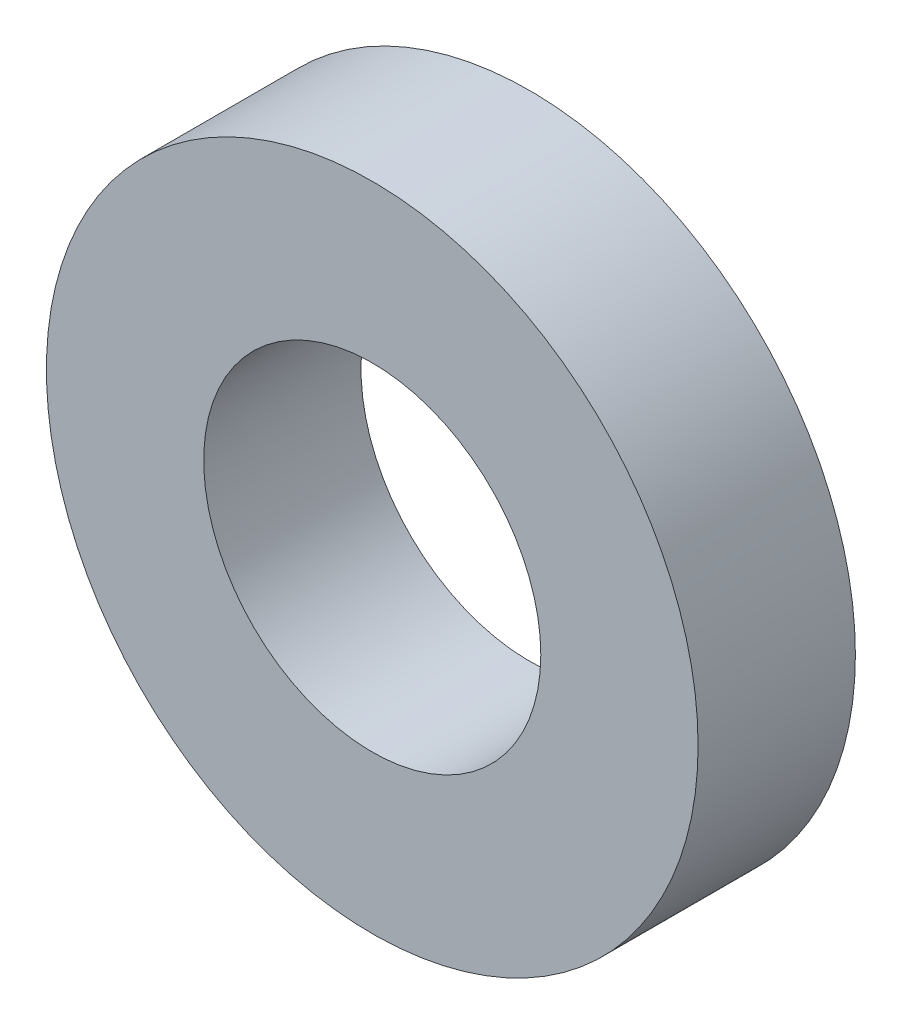
ISO-10303-21;
HEADER;
FILE_DESCRIPTION(('STEP AP214'),'2;1');
FILE_NAME('part.step','',(''),(''),'','','');
FILE_SCHEMA(('AUTOMOTIVE_DESIGN { 1 0 10303 214 1 1 1 1 }'));
ENDSEC;
DATA;
#1=APPLICATION_CONTEXT('core data for automotive mechanical design processes');
#2=APPLICATION_PROTOCOL_DEFINITION('international standard','automotive_design',2000,#1);
#3=PRODUCT_CONTEXT('',#1,'mechanical');
#4=PRODUCT('Part','Part','',(#3));
#5=PRODUCT_RELATED_PRODUCT_CATEGORY('part','',(#4));
#6=PRODUCT_DEFINITION_FORMATION('','',#4);
#7=PRODUCT_DEFINITION_CONTEXT('part definition',#1,'design');
#8=PRODUCT_DEFINITION('design','',#6,#7);
#9=PRODUCT_DEFINITION_SHAPE('','',#8);
#10=(LENGTH_UNIT() NAMED_UNIT(*) SI_UNIT(.MILLI.,.METRE.));
#11=(NAMED_UNIT(*) PLANE_ANGLE_UNIT() SI_UNIT($,.RADIAN.));
#12=(NAMED_UNIT(*) SI_UNIT($,.STERADIAN.) SOLID_ANGLE_UNIT());
#13=UNCERTAINTY_MEASURE_WITH_UNIT(LENGTH_MEASURE(1.E-05),#10,'distance_accuracy_value','');
#14=(GEOMETRIC_REPRESENTATION_CONTEXT(3) GLOBAL_UNCERTAINTY_ASSIGNED_CONTEXT((#13)) GLOBAL_UNIT_ASSIGNED_CONTEXT((#10,
#11,#12)) REPRESENTATION_CONTEXT('',''));
#15=CARTESIAN_POINT('',(0.,0.,0.));
#16=DIRECTION('',(0.,0.,1.));
#17=DIRECTION('',(1.,0.,0.));
#18=AXIS2_PLACEMENT_3D('',#15,#16,#17);
#19=CARTESIAN_POINT('',(0.,0.,1.4));
#20=DIRECTION('',(0.,0.,1.));
#21=DIRECTION('',(1.,0.,0.));
#22=AXIS2_PLACEMENT_3D('',#19,#20,#21);
#23=CYLINDRICAL_SURFACE('',#22,1.5);
#24=CARTESIAN_POINT('',(0.,0.,0.));
#25=DIRECTION('',(0.,0.,1.));
#26=DIRECTION('',(1.,0.,0.));
#27=AXIS2_PLACEMENT_3D('',#24,#25,#26);
#28=CIRCLE('',#27,1.5);
#29=CARTESIAN_POINT('',(1.5,0.,0.));
#30=VERTEX_POINT('',#29);
#31=EDGE_CURVE('E26',#30,#30,#28,.T.);
#32=ORIENTED_EDGE('',*,*,#31,.F.);
#33=EDGE_LOOP('',(#32));
#34=FACE_BOUND('',#33,.T.);
#35=CARTESIAN_POINT('',(0.,0.,1.4));
#36=DIRECTION('',(0.,0.,1.));
#37=DIRECTION('',(1.,0.,0.));
#38=AXIS2_PLACEMENT_3D('',#35,#36,#37);
#39=CIRCLE('',#38,1.5);
#40=CARTESIAN_POINT('',(1.5,0.,1.4));
#41=VERTEX_POINT('',#40);
#42=EDGE_CURVE('E17',#41,#41,#39,.T.);
#43=ORIENTED_EDGE('',*,*,#42,.T.);
#44=EDGE_LOOP('',(#43));
#45=FACE_BOUND('',#44,.T.);
#46=ADVANCED_FACE('F14',(#34,#45),#23,.F.);
#47=CARTESIAN_POINT('',(0.,0.,1.4));
#48=DIRECTION('',(0.,0.,-1.));
#49=DIRECTION('',(-1.,0.,0.));
#50=AXIS2_PLACEMENT_3D('',#47,#48,#49);
#51=PLANE('',#50);
#52=CARTESIAN_POINT('',(0.,0.,1.4));
#53=DIRECTION('',(0.,0.,1.));
#54=DIRECTION('',(1.,0.,0.));
#55=AXIS2_PLACEMENT_3D('',#52,#53,#54);
#56=CIRCLE('',#55,2.9);
#57=CARTESIAN_POINT('',(2.9,0.,1.4));
#58=VERTEX_POINT('',#57);
#59=EDGE_CURVE('E21',#58,#58,#56,.F.);
#60=ORIENTED_EDGE('',*,*,#59,.F.);
#61=EDGE_LOOP('',(#60));
#62=FACE_BOUND('',#61,.T.);
#63=ORIENTED_EDGE('',*,*,#42,.F.);
#64=EDGE_LOOP('',(#63));
#65=FACE_BOUND('',#64,.T.);
#66=ADVANCED_FACE('F35',(#62,#65),#51,.F.);
#67=CARTESIAN_POINT('',(0.,0.,0.));
#68=DIRECTION('',(0.,0.,-1.));
#69=DIRECTION('',(-1.,0.,0.));
#70=AXIS2_PLACEMENT_3D('',#67,#68,#69);
#71=PLANE('',#70);
#72=CARTESIAN_POINT('',(0.,0.,0.));
#73=DIRECTION('',(0.,0.,1.));
#74=DIRECTION('',(1.,0.,0.));
#75=AXIS2_PLACEMENT_3D('',#72,#73,#74);
#76=CIRCLE('',#75,2.9);
#77=CARTESIAN_POINT('',(2.9,0.,0.));
#78=VERTEX_POINT('',#77);
#79=EDGE_CURVE('E10',#78,#78,#76,.T.);
#80=ORIENTED_EDGE('',*,*,#79,.F.);
#81=EDGE_LOOP('',(#80));
#82=FACE_BOUND('',#81,.T.);
#83=ORIENTED_EDGE('',*,*,#31,.T.);
#84=EDGE_LOOP('',(#83));
#85=FACE_BOUND('',#84,.T.);
#86=ADVANCED_FACE('F37',(#82,#85),#71,.T.);
#87=CARTESIAN_POINT('',(0.,0.,1.4));
#88=DIRECTION('',(0.,0.,1.));
#89=DIRECTION('',(1.,0.,0.));
#90=AXIS2_PLACEMENT_3D('',#87,#88,#89);
#91=CYLINDRICAL_SURFACE('',#90,2.9);
#92=ORIENTED_EDGE('',*,*,#79,.T.);
#93=EDGE_LOOP('',(#92));
#94=FACE_BOUND('',#93,.T.);
#95=ORIENTED_EDGE('',*,*,#59,.T.);
#96=EDGE_LOOP('',(#95));
#97=FACE_BOUND('',#96,.T.);
#98=ADVANCED_FACE('F44',(#94,#97),#91,.T.);
#99=CLOSED_SHELL('',(#46,#66,#86,#98));
#100=MANIFOLD_SOLID_BREP('B1',#99);
#101=ADVANCED_BREP_SHAPE_REPRESENTATION('',(#18,#100),#14);
#102=SHAPE_DEFINITION_REPRESENTATION(#9,#101);
ENDSEC;
END-ISO-10303-21;
